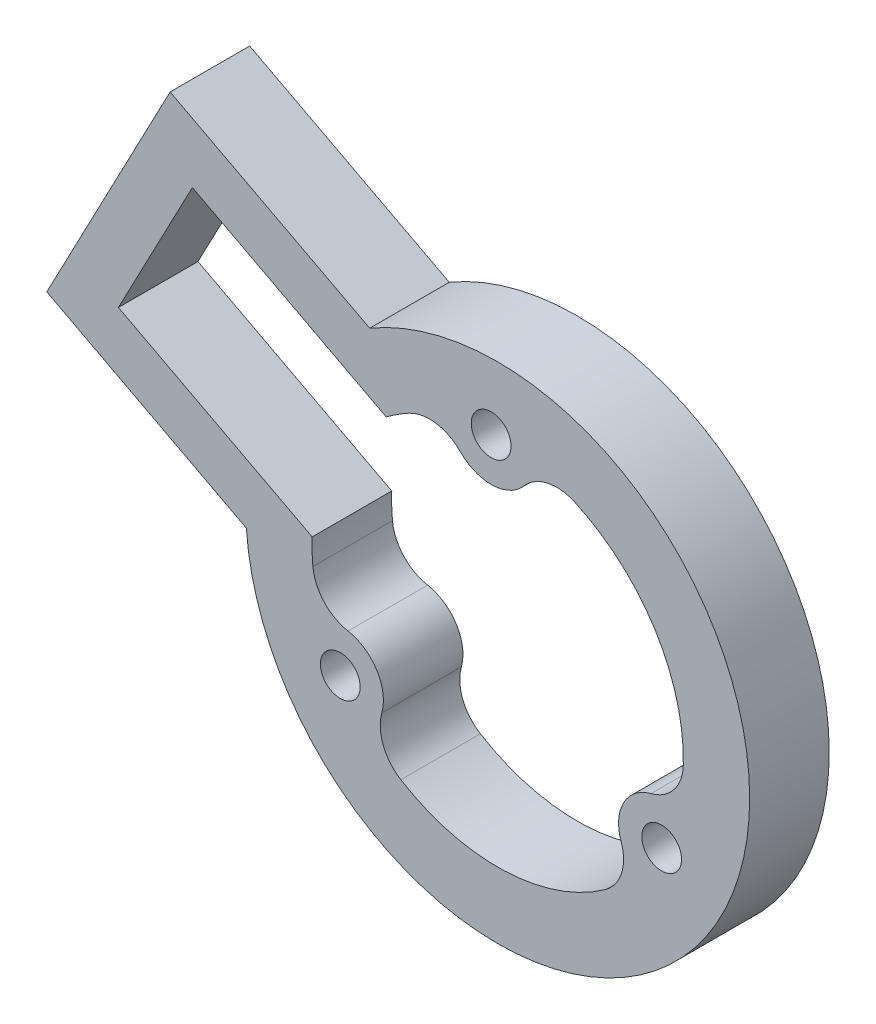
ISO-10303-21;
HEADER;
FILE_DESCRIPTION(('STEP AP214'),'2;1');
FILE_NAME('part.step','',(''),(''),'','','');
FILE_SCHEMA(('AUTOMOTIVE_DESIGN { 1 0 10303 214 1 1 1 1 }'));
ENDSEC;
DATA;
#1=APPLICATION_CONTEXT('core data for automotive mechanical design processes');
#2=APPLICATION_PROTOCOL_DEFINITION('international standard','automotive_design',2000,#1);
#3=PRODUCT_CONTEXT('',#1,'mechanical');
#4=PRODUCT('Part','Part','',(#3));
#5=PRODUCT_RELATED_PRODUCT_CATEGORY('part','',(#4));
#6=PRODUCT_DEFINITION_FORMATION('','',#4);
#7=PRODUCT_DEFINITION_CONTEXT('part definition',#1,'design');
#8=PRODUCT_DEFINITION('design','',#6,#7);
#9=PRODUCT_DEFINITION_SHAPE('','',#8);
#10=(LENGTH_UNIT() NAMED_UNIT(*) SI_UNIT(.MILLI.,.METRE.));
#11=(NAMED_UNIT(*) PLANE_ANGLE_UNIT() SI_UNIT($,.RADIAN.));
#12=(NAMED_UNIT(*) SI_UNIT($,.STERADIAN.) SOLID_ANGLE_UNIT());
#13=UNCERTAINTY_MEASURE_WITH_UNIT(LENGTH_MEASURE(1.E-05),#10,'distance_accuracy_value','');
#14=(GEOMETRIC_REPRESENTATION_CONTEXT(3) GLOBAL_UNCERTAINTY_ASSIGNED_CONTEXT((#13)) GLOBAL_UNIT_ASSIGNED_CONTEXT((#10,
#11,#12)) REPRESENTATION_CONTEXT('',''));
#15=CARTESIAN_POINT('',(0.,0.,0.));
#16=DIRECTION('',(0.,0.,1.));
#17=DIRECTION('',(1.,0.,0.));
#18=AXIS2_PLACEMENT_3D('',#15,#16,#17);
#19=CARTESIAN_POINT('',(0.,0.,6.));
#20=DIRECTION('',(0.,0.,1.));
#21=DIRECTION('',(1.,0.,0.));
#22=AXIS2_PLACEMENT_3D('',#19,#20,#21);
#23=PLANE('',#22);
#24=CARTESIAN_POINT('',(0.,0.,6.));
#25=DIRECTION('',(0.,0.,1.));
#26=DIRECTION('',(1.,0.,0.));
#27=AXIS2_PLACEMENT_3D('',#24,#25,#26);
#28=CIRCLE('',#27,14.);
#29=CARTESIAN_POINT('',(13.9955052642864,-0.354728624911595,6.));
#30=VERTEX_POINT('',#29);
#31=CARTESIAN_POINT('',(5.80690829075814,12.7389095335011,6.));
#32=VERTEX_POINT('',#31);
#33=EDGE_CURVE('E178',#30,#32,#28,.T.);
#34=ORIENTED_EDGE('',*,*,#33,.F.);
#35=CARTESIAN_POINT('',(10.7465486850771,-0.272380908414255,6.));
#36=DIRECTION('',(0.,0.,1.));
#37=DIRECTION('',(1.,0.,0.));
#38=AXIS2_PLACEMENT_3D('',#35,#36,#37);
#39=CIRCLE('',#38,3.25);
#40=CARTESIAN_POINT('',(11.5551312818012,-3.42018874630315,6.));
#41=VERTEX_POINT('',#40);
#42=EDGE_CURVE('E170',#41,#30,#39,.T.);
#43=ORIENTED_EDGE('',*,*,#42,.F.);
#44=CARTESIAN_POINT('',(12.3637138785254,-6.56799658419206,6.));
#45=DIRECTION('',(0.,0.,-1.));
#46=DIRECTION('',(1.,0.,0.));
#47=AXIS2_PLACEMENT_3D('',#44,#45,#46);
#48=CIRCLE('',#47,3.25);
#49=CARTESIAN_POINT('',(9.30272212200573,-7.66016390952212,6.));
#50=VERTEX_POINT('',#49);
#51=EDGE_CURVE('E221',#50,#41,#48,.T.);
#52=ORIENTED_EDGE('',*,*,#51,.F.);
#53=CARTESIAN_POINT('',(6.24173036548606,-8.75233123485219,6.));
#54=DIRECTION('',(0.,0.,1.));
#55=DIRECTION('',(1.,0.,0.));
#56=AXIS2_PLACEMENT_3D('',#53,#54,#55);
#57=CIRCLE('',#56,3.25);
#58=CARTESIAN_POINT('',(8.12876512714463,-11.3983848639936,6.));
#59=VERTEX_POINT('',#58);
#60=EDGE_CURVE('E219',#59,#50,#57,.T.);
#61=ORIENTED_EDGE('',*,*,#60,.F.);
#62=CARTESIAN_POINT('',(0.,0.,6.));
#63=DIRECTION('',(0.,0.,1.));
#64=DIRECTION('',(1.,0.,0.));
#65=AXIS2_PLACEMENT_3D('',#62,#63,#64);
#66=CIRCLE('',#65,14.);
#67=CARTESIAN_POINT('',(-7.30495663276615,-11.9430987852151,6.));
#68=VERTEX_POINT('',#67);
#69=EDGE_CURVE('E217',#68,#59,#66,.T.);
#70=ORIENTED_EDGE('',*,*,#69,.F.);
#71=CARTESIAN_POINT('',(-5.60916312873115,-9.17059371007586,6.));
#72=DIRECTION('',(0.,0.,1.));
#73=DIRECTION('',(1.,0.,0.));
#74=AXIS2_PLACEMENT_3D('',#71,#72,#73);
#75=CIRCLE('',#74,3.25);
#76=CARTESIAN_POINT('',(-8.73953598093679,-8.29694286095253,6.));
#77=VERTEX_POINT('',#76);
#78=EDGE_CURVE('E215',#77,#68,#75,.T.);
#79=ORIENTED_EDGE('',*,*,#78,.F.);
#80=CARTESIAN_POINT('',(-11.8699088331424,-7.4232920118292,6.));
#81=DIRECTION('',(0.,0.,-1.));
#82=DIRECTION('',(1.,0.,0.));
#83=AXIS2_PLACEMENT_3D('',#80,#81,#82);
#84=CIRCLE('',#83,3.25);
#85=CARTESIAN_POINT('',(-11.2852576038017,-4.22631172724338,6.));
#86=VERTEX_POINT('',#85);
#87=EDGE_CURVE('E213',#86,#77,#84,.T.);
#88=ORIENTED_EDGE('',*,*,#87,.F.);
#89=CARTESIAN_POINT('',(-10.7006063744611,-1.02933144265756,6.));
#90=DIRECTION('',(0.,0.,1.));
#91=DIRECTION('',(1.,0.,0.));
#92=AXIS2_PLACEMENT_3D('',#89,#90,#91);
#93=CIRCLE('',#92,3.25);
#94=CARTESIAN_POINT('',(-13.9356734179028,-1.34052466950752,6.));
#95=VERTEX_POINT('',#94);
#96=EDGE_CURVE('E211',#95,#86,#93,.T.);
#97=ORIENTED_EDGE('',*,*,#96,.F.);
#98=CARTESIAN_POINT('',(0.,0.,6.));
#99=DIRECTION('',(0.,0.,1.));
#100=DIRECTION('',(1.,0.,0.));
#101=AXIS2_PLACEMENT_3D('',#98,#99,#100);
#102=CIRCLE('',#101,14.);
#103=CARTESIAN_POINT('',(-13.9883844032285,0.570176979115798,6.));
#104=VERTEX_POINT('',#103);
#105=EDGE_CURVE('E209',#104,#95,#102,.T.);
#106=ORIENTED_EDGE('',*,*,#105,.F.);
#107=DIRECTION('',(0.885303878193953,-0.465012949555974,0.));
#108=VECTOR('',#107,1.);
#109=CARTESIAN_POINT('',(-28.6015499792665,8.24585918749596,6.));
#110=LINE('',#109,#108);
#111=CARTESIAN_POINT('',(-28.6015499792665,8.24585918749596,6.));
#112=VERTEX_POINT('',#111);
#113=EDGE_CURVE('E207',#112,#104,#110,.T.);
#114=ORIENTED_EDGE('',*,*,#113,.F.);
#115=DIRECTION('',(-0.465012949555981,-0.885303878193949,0.));
#116=VECTOR('',#115,1.);
#117=CARTESIAN_POINT('',(-23.0213945845947,18.8695057258234,6.));
#118=LINE('',#117,#116);
#119=CARTESIAN_POINT('',(-23.0213945845947,18.8695057258234,6.));
#120=VERTEX_POINT('',#119);
#121=EDGE_CURVE('E205',#120,#112,#118,.T.);
#122=ORIENTED_EDGE('',*,*,#121,.F.);
#123=DIRECTION('',(-0.885303878193952,0.465012949555975,0.));
#124=VECTOR('',#123,1.);
#125=CARTESIAN_POINT('',(-11.5124441680734,12.8243373815957,6.));
#126=LINE('',#125,#124);
#127=CARTESIAN_POINT('',(-8.40822900855676,11.1938235174432,6.));
#128=VERTEX_POINT('',#127);
#129=EDGE_CURVE('E203',#128,#120,#126,.T.);
#130=ORIENTED_EDGE('',*,*,#129,.F.);
#131=CARTESIAN_POINT('',(0.,0.,6.));
#132=DIRECTION('',(0.,0.,1.));
#133=DIRECTION('',(1.,0.,0.));
#134=AXIS2_PLACEMENT_3D('',#131,#132,#133);
#135=CIRCLE('',#134,14.);
#136=CARTESIAN_POINT('',(-6.69054863152024,12.2978274101267,6.));
#137=VERTEX_POINT('',#136);
#138=EDGE_CURVE('E201',#137,#128,#135,.T.);
#139=ORIENTED_EDGE('',*,*,#138,.F.);
#140=CARTESIAN_POINT('',(-5.1373855563459,9.44297461849011,6.));
#141=DIRECTION('',(0.,0.,1.));
#142=DIRECTION('',(1.,0.,0.));
#143=AXIS2_PLACEMENT_3D('',#140,#141,#142);
#144=CIRCLE('',#143,3.25);
#145=CARTESIAN_POINT('',(-2.81559530086442,11.7171316072557,6.));
#146=VERTEX_POINT('',#145);
#147=EDGE_CURVE('E199',#146,#137,#144,.T.);
#148=ORIENTED_EDGE('',*,*,#147,.F.);
#149=CARTESIAN_POINT('',(-0.493805045382954,13.9912885960213,6.));
#150=DIRECTION('',(0.,0.,-1.));
#151=DIRECTION('',(1.,0.,0.));
#152=AXIS2_PLACEMENT_3D('',#149,#150,#151);
#153=CIRCLE('',#152,3.25);
#154=CARTESIAN_POINT('',(1.98253548179602,11.8864756367655,6.));
#155=VERTEX_POINT('',#154);
#156=EDGE_CURVE('E194',#155,#146,#153,.T.);
#157=ORIENTED_EDGE('',*,*,#156,.F.);
#158=CARTESIAN_POINT('',(4.458876008975,9.78166267750975,6.));
#159=DIRECTION('',(0.,0.,1.));
#160=DIRECTION('',(1.,0.,0.));
#161=AXIS2_PLACEMENT_3D('',#158,#159,#160);
#162=CIRCLE('',#161,3.25);
#163=EDGE_CURVE('E192',#32,#155,#162,.T.);
#164=ORIENTED_EDGE('',*,*,#163,.F.);
#165=EDGE_LOOP('',(#34,#43,#52,#61,#70,#79,#88,#97,#106,#114,#122,#130,#139,#148,#157,#164));
#166=FACE_BOUND('',#165,.T.);
#167=CARTESIAN_POINT('',(12.3637138785254,-6.56799658419206,6.));
#168=DIRECTION('',(0.,0.,1.));
#169=DIRECTION('',(1.,0.,0.));
#170=AXIS2_PLACEMENT_3D('',#167,#168,#169);
#171=CIRCLE('',#170,1.50000000000007);
#172=CARTESIAN_POINT('',(13.8637138785255,-6.56799658419206,6.));
#173=VERTEX_POINT('',#172);
#174=EDGE_CURVE('E296',#173,#173,#171,.T.);
#175=ORIENTED_EDGE('',*,*,#174,.F.);
#176=EDGE_LOOP('',(#175));
#177=FACE_BOUND('',#176,.T.);
#178=CARTESIAN_POINT('',(0.,0.,6.));
#179=DIRECTION('',(0.,0.,1.));
#180=DIRECTION('',(1.,0.,0.));
#181=AXIS2_PLACEMENT_3D('',#178,#179,#180);
#182=CIRCLE('',#181,19.);
#183=CARTESIAN_POINT('',(-18.952651360969,-1.34052466950752,6.));
#184=VERTEX_POINT('',#183);
#185=CARTESIAN_POINT('',(-9.65239236984949,16.3655528943715,6.));
#186=VERTEX_POINT('',#185);
#187=EDGE_CURVE('E308',#184,#186,#182,.T.);
#188=ORIENTED_EDGE('',*,*,#187,.T.);
#189=DIRECTION('',(-0.88530387819395,0.46501294955598,0.));
#190=VECTOR('',#189,1.);
#191=CARTESIAN_POINT('',(-9.65239236984949,16.3655528943715,6.));
#192=LINE('',#191,#190);
#193=CARTESIAN_POINT('',(-24.7025582991466,24.2707730368232,6.));
#194=VERTEX_POINT('',#193);
#195=EDGE_CURVE('E311',#186,#194,#192,.T.);
#196=ORIENTED_EDGE('',*,*,#195,.T.);
#197=DIRECTION('',(-0.465012949555977,-0.885303878193951,0.));
#198=VECTOR('',#197,1.);
#199=CARTESIAN_POINT('',(-24.7025582991466,24.2707730368232,6.));
#200=LINE('',#199,#198);
#201=CARTESIAN_POINT('',(-34.0028172902662,6.56469547294415,6.));
#202=VERTEX_POINT('',#201);
#203=EDGE_CURVE('E314',#194,#202,#200,.T.);
#204=ORIENTED_EDGE('',*,*,#203,.T.);
#205=DIRECTION('',(0.885303878193949,-0.465012949555981,0.));
#206=VECTOR('',#205,1.);
#207=CARTESIAN_POINT('',(-18.952651360969,-1.34052466950752,6.));
#208=LINE('',#207,#206);
#209=EDGE_CURVE('E316',#202,#184,#208,.T.);
#210=ORIENTED_EDGE('',*,*,#209,.T.);
#211=EDGE_LOOP('',(#188,#196,#204,#210));
#212=FACE_BOUND('',#211,.T.);
#213=CARTESIAN_POINT('',(-0.493805045382954,13.9912885960213,6.));
#214=DIRECTION('',(0.,0.,1.));
#215=DIRECTION('',(1.,0.,0.));
#216=AXIS2_PLACEMENT_3D('',#213,#214,#215);
#217=CIRCLE('',#216,1.5);
#218=CARTESIAN_POINT('',(1.00619495461705,13.9912885960213,6.));
#219=VERTEX_POINT('',#218);
#220=EDGE_CURVE('E302',#219,#219,#217,.T.);
#221=ORIENTED_EDGE('',*,*,#220,.F.);
#222=EDGE_LOOP('',(#221));
#223=FACE_BOUND('',#222,.T.);
#224=CARTESIAN_POINT('',(-11.8699088331424,-7.4232920118292,6.));
#225=DIRECTION('',(0.,0.,1.));
#226=DIRECTION('',(1.,0.,0.));
#227=AXIS2_PLACEMENT_3D('',#224,#225,#226);
#228=CIRCLE('',#227,1.50000000000014);
#229=CARTESIAN_POINT('',(-10.3699088331423,-7.4232920118292,6.));
#230=VERTEX_POINT('',#229);
#231=EDGE_CURVE('E224',#230,#230,#228,.T.);
#232=ORIENTED_EDGE('',*,*,#231,.F.);
#233=EDGE_LOOP('',(#232));
#234=FACE_BOUND('',#233,.T.);
#235=ADVANCED_FACE('F33',(#166,#177,#212,#223,#234),#23,.T.);
#236=CARTESIAN_POINT('',(0.,0.,0.));
#237=DIRECTION('',(0.,0.,1.));
#238=DIRECTION('',(1.,0.,0.));
#239=AXIS2_PLACEMENT_3D('',#236,#237,#238);
#240=PLANE('',#239);
#241=CARTESIAN_POINT('',(12.3637138785254,-6.56799658419206,0.));
#242=DIRECTION('',(0.,0.,1.));
#243=DIRECTION('',(1.,0.,0.));
#244=AXIS2_PLACEMENT_3D('',#241,#242,#243);
#245=CIRCLE('',#244,1.50000000000007);
#246=CARTESIAN_POINT('',(13.8637138785255,-6.56799658419206,0.));
#247=VERTEX_POINT('',#246);
#248=EDGE_CURVE('E186',#247,#247,#245,.T.);
#249=ORIENTED_EDGE('',*,*,#248,.T.);
#250=EDGE_LOOP('',(#249));
#251=FACE_BOUND('',#250,.T.);
#252=CARTESIAN_POINT('',(-0.493805045382954,13.9912885960213,0.));
#253=DIRECTION('',(0.,0.,1.));
#254=DIRECTION('',(1.,0.,0.));
#255=AXIS2_PLACEMENT_3D('',#252,#253,#254);
#256=CIRCLE('',#255,1.5);
#257=CARTESIAN_POINT('',(1.00619495461705,13.9912885960213,0.));
#258=VERTEX_POINT('',#257);
#259=EDGE_CURVE('E299',#258,#258,#256,.T.);
#260=ORIENTED_EDGE('',*,*,#259,.T.);
#261=EDGE_LOOP('',(#260));
#262=FACE_BOUND('',#261,.T.);
#263=CARTESIAN_POINT('',(0.,0.,0.));
#264=DIRECTION('',(0.,0.,1.));
#265=DIRECTION('',(1.,0.,0.));
#266=AXIS2_PLACEMENT_3D('',#263,#264,#265);
#267=CIRCLE('',#266,19.);
#268=CARTESIAN_POINT('',(-18.952651360969,-1.34052466950752,0.));
#269=VERTEX_POINT('',#268);
#270=CARTESIAN_POINT('',(-9.65239236984949,16.3655528943715,0.));
#271=VERTEX_POINT('',#270);
#272=EDGE_CURVE('E305',#269,#271,#267,.T.);
#273=ORIENTED_EDGE('',*,*,#272,.F.);
#274=DIRECTION('',(0.885303878193949,-0.465012949555981,0.));
#275=VECTOR('',#274,1.);
#276=CARTESIAN_POINT('',(-18.952651360969,-1.34052466950752,0.));
#277=LINE('',#276,#275);
#278=CARTESIAN_POINT('',(-34.0028172902662,6.56469547294415,0.));
#279=VERTEX_POINT('',#278);
#280=EDGE_CURVE('E312',#279,#269,#277,.T.);
#281=ORIENTED_EDGE('',*,*,#280,.F.);
#282=DIRECTION('',(-0.465012949555977,-0.885303878193951,0.));
#283=VECTOR('',#282,1.);
#284=CARTESIAN_POINT('',(-24.7025582991466,24.2707730368232,0.));
#285=LINE('',#284,#283);
#286=CARTESIAN_POINT('',(-24.7025582991466,24.2707730368232,0.));
#287=VERTEX_POINT('',#286);
#288=EDGE_CURVE('E323',#287,#279,#285,.T.);
#289=ORIENTED_EDGE('',*,*,#288,.F.);
#290=DIRECTION('',(-0.88530387819395,0.46501294955598,0.));
#291=VECTOR('',#290,1.);
#292=CARTESIAN_POINT('',(-9.65239236984949,16.3655528943715,0.));
#293=LINE('',#292,#291);
#294=EDGE_CURVE('E321',#271,#287,#293,.T.);
#295=ORIENTED_EDGE('',*,*,#294,.F.);
#296=EDGE_LOOP('',(#273,#281,#289,#295));
#297=FACE_BOUND('',#296,.T.);
#298=CARTESIAN_POINT('',(10.7465486850771,-0.272380908414255,0.));
#299=DIRECTION('',(0.,0.,1.));
#300=DIRECTION('',(1.,0.,0.));
#301=AXIS2_PLACEMENT_3D('',#298,#299,#300);
#302=CIRCLE('',#301,3.25);
#303=CARTESIAN_POINT('',(11.5551312818012,-3.42018874630315,0.));
#304=VERTEX_POINT('',#303);
#305=CARTESIAN_POINT('',(13.9955052642864,-0.354728624911595,0.));
#306=VERTEX_POINT('',#305);
#307=EDGE_CURVE('E56',#304,#306,#302,.T.);
#308=ORIENTED_EDGE('',*,*,#307,.T.);
#309=CARTESIAN_POINT('',(0.,0.,0.));
#310=DIRECTION('',(0.,0.,1.));
#311=DIRECTION('',(1.,0.,0.));
#312=AXIS2_PLACEMENT_3D('',#309,#310,#311);
#313=CIRCLE('',#312,14.);
#314=CARTESIAN_POINT('',(5.80690829075814,12.7389095335011,0.));
#315=VERTEX_POINT('',#314);
#316=EDGE_CURVE('E185',#306,#315,#313,.T.);
#317=ORIENTED_EDGE('',*,*,#316,.T.);
#318=CARTESIAN_POINT('',(4.458876008975,9.78166267750975,0.));
#319=DIRECTION('',(0.,0.,1.));
#320=DIRECTION('',(1.,0.,0.));
#321=AXIS2_PLACEMENT_3D('',#318,#319,#320);
#322=CIRCLE('',#321,3.25);
#323=CARTESIAN_POINT('',(1.98253548179602,11.8864756367655,0.));
#324=VERTEX_POINT('',#323);
#325=EDGE_CURVE('E226',#315,#324,#322,.T.);
#326=ORIENTED_EDGE('',*,*,#325,.T.);
#327=CARTESIAN_POINT('',(-0.493805045382954,13.9912885960213,0.));
#328=DIRECTION('',(0.,0.,-1.));
#329=DIRECTION('',(1.,0.,0.));
#330=AXIS2_PLACEMENT_3D('',#327,#328,#329);
#331=CIRCLE('',#330,3.25);
#332=CARTESIAN_POINT('',(-2.81559530086442,11.7171316072557,0.));
#333=VERTEX_POINT('',#332);
#334=EDGE_CURVE('E229',#324,#333,#331,.T.);
#335=ORIENTED_EDGE('',*,*,#334,.T.);
#336=CARTESIAN_POINT('',(-5.1373855563459,9.44297461849011,0.));
#337=DIRECTION('',(0.,0.,1.));
#338=DIRECTION('',(1.,0.,0.));
#339=AXIS2_PLACEMENT_3D('',#336,#337,#338);
#340=CIRCLE('',#339,3.25);
#341=CARTESIAN_POINT('',(-6.69054863152024,12.2978274101267,0.));
#342=VERTEX_POINT('',#341);
#343=EDGE_CURVE('E232',#333,#342,#340,.T.);
#344=ORIENTED_EDGE('',*,*,#343,.T.);
#345=CARTESIAN_POINT('',(0.,0.,0.));
#346=DIRECTION('',(0.,0.,1.));
#347=DIRECTION('',(1.,0.,0.));
#348=AXIS2_PLACEMENT_3D('',#345,#346,#347);
#349=CIRCLE('',#348,14.);
#350=CARTESIAN_POINT('',(-8.40822900855676,11.1938235174432,0.));
#351=VERTEX_POINT('',#350);
#352=EDGE_CURVE('E235',#342,#351,#349,.T.);
#353=ORIENTED_EDGE('',*,*,#352,.T.);
#354=DIRECTION('',(-0.885303878193949,0.465012949555981,0.));
#355=VECTOR('',#354,1.);
#356=CARTESIAN_POINT('',(-11.5124441680734,12.8243373815957,0.));
#357=LINE('',#356,#355);
#358=CARTESIAN_POINT('',(-23.0213945845947,18.8695057258234,0.));
#359=VERTEX_POINT('',#358);
#360=EDGE_CURVE('E238',#351,#359,#357,.T.);
#361=ORIENTED_EDGE('',*,*,#360,.T.);
#362=DIRECTION('',(-0.465012949555981,-0.885303878193949,0.));
#363=VECTOR('',#362,1.);
#364=CARTESIAN_POINT('',(-23.0213945845947,18.8695057258234,0.));
#365=LINE('',#364,#363);
#366=CARTESIAN_POINT('',(-28.6015499792665,8.24585918749596,0.));
#367=VERTEX_POINT('',#366);
#368=EDGE_CURVE('E241',#359,#367,#365,.T.);
#369=ORIENTED_EDGE('',*,*,#368,.T.);
#370=DIRECTION('',(0.885303878193952,-0.465012949555974,0.));
#371=VECTOR('',#370,1.);
#372=CARTESIAN_POINT('',(-17.0925995627451,2.20069084326828,0.));
#373=LINE('',#372,#371);
#374=CARTESIAN_POINT('',(-13.9883844032285,0.570176979115798,0.));
#375=VERTEX_POINT('',#374);
#376=EDGE_CURVE('E244',#367,#375,#373,.T.);
#377=ORIENTED_EDGE('',*,*,#376,.T.);
#378=CARTESIAN_POINT('',(0.,0.,0.));
#379=DIRECTION('',(0.,0.,1.));
#380=DIRECTION('',(1.,0.,0.));
#381=AXIS2_PLACEMENT_3D('',#378,#379,#380);
#382=CIRCLE('',#381,14.);
#383=CARTESIAN_POINT('',(-13.9356734179028,-1.34052466950752,0.));
#384=VERTEX_POINT('',#383);
#385=EDGE_CURVE('E247',#375,#384,#382,.T.);
#386=ORIENTED_EDGE('',*,*,#385,.T.);
#387=CARTESIAN_POINT('',(-10.7006063744611,-1.02933144265756,0.));
#388=DIRECTION('',(0.,0.,1.));
#389=DIRECTION('',(1.,0.,0.));
#390=AXIS2_PLACEMENT_3D('',#387,#388,#389);
#391=CIRCLE('',#390,3.25);
#392=CARTESIAN_POINT('',(-11.2852576038017,-4.22631172724338,0.));
#393=VERTEX_POINT('',#392);
#394=EDGE_CURVE('E250',#384,#393,#391,.T.);
#395=ORIENTED_EDGE('',*,*,#394,.T.);
#396=CARTESIAN_POINT('',(-11.8699088331424,-7.4232920118292,0.));
#397=DIRECTION('',(0.,0.,-1.));
#398=DIRECTION('',(1.,0.,0.));
#399=AXIS2_PLACEMENT_3D('',#396,#397,#398);
#400=CIRCLE('',#399,3.25);
#401=CARTESIAN_POINT('',(-8.73953598093679,-8.29694286095253,0.));
#402=VERTEX_POINT('',#401);
#403=EDGE_CURVE('E253',#393,#402,#400,.T.);
#404=ORIENTED_EDGE('',*,*,#403,.T.);
#405=CARTESIAN_POINT('',(-5.60916312873115,-9.17059371007586,0.));
#406=DIRECTION('',(0.,0.,1.));
#407=DIRECTION('',(1.,0.,0.));
#408=AXIS2_PLACEMENT_3D('',#405,#406,#407);
#409=CIRCLE('',#408,3.25);
#410=CARTESIAN_POINT('',(-7.30495663276615,-11.9430987852151,0.));
#411=VERTEX_POINT('',#410);
#412=EDGE_CURVE('E256',#402,#411,#409,.T.);
#413=ORIENTED_EDGE('',*,*,#412,.T.);
#414=CARTESIAN_POINT('',(0.,0.,0.));
#415=DIRECTION('',(0.,0.,1.));
#416=DIRECTION('',(1.,0.,0.));
#417=AXIS2_PLACEMENT_3D('',#414,#415,#416);
#418=CIRCLE('',#417,14.);
#419=CARTESIAN_POINT('',(8.12876512714463,-11.3983848639936,0.));
#420=VERTEX_POINT('',#419);
#421=EDGE_CURVE('E259',#411,#420,#418,.T.);
#422=ORIENTED_EDGE('',*,*,#421,.T.);
#423=CARTESIAN_POINT('',(6.24173036548606,-8.75233123485219,0.));
#424=DIRECTION('',(0.,0.,1.));
#425=DIRECTION('',(1.,0.,0.));
#426=AXIS2_PLACEMENT_3D('',#423,#424,#425);
#427=CIRCLE('',#426,3.25);
#428=CARTESIAN_POINT('',(9.30272212200573,-7.66016390952212,0.));
#429=VERTEX_POINT('',#428);
#430=EDGE_CURVE('E262',#420,#429,#427,.T.);
#431=ORIENTED_EDGE('',*,*,#430,.T.);
#432=CARTESIAN_POINT('',(12.3637138785254,-6.56799658419206,0.));
#433=DIRECTION('',(0.,0.,-1.));
#434=DIRECTION('',(1.,0.,0.));
#435=AXIS2_PLACEMENT_3D('',#432,#433,#434);
#436=CIRCLE('',#435,3.25);
#437=EDGE_CURVE('E179',#429,#304,#436,.T.);
#438=ORIENTED_EDGE('',*,*,#437,.T.);
#439=EDGE_LOOP('',(#308,#317,#326,#335,#344,#353,#361,#369,#377,#386,#395,#404,#413,#422,#431,#438));
#440=FACE_BOUND('',#439,.T.);
#441=CARTESIAN_POINT('',(-11.8699088331424,-7.4232920118292,0.));
#442=DIRECTION('',(0.,0.,1.));
#443=DIRECTION('',(1.,0.,0.));
#444=AXIS2_PLACEMENT_3D('',#441,#442,#443);
#445=CIRCLE('',#444,1.50000000000014);
#446=CARTESIAN_POINT('',(-10.3699088331423,-7.4232920118292,0.));
#447=VERTEX_POINT('',#446);
#448=EDGE_CURVE('E388',#447,#447,#445,.T.);
#449=ORIENTED_EDGE('',*,*,#448,.T.);
#450=EDGE_LOOP('',(#449));
#451=FACE_BOUND('',#450,.T.);
#452=ADVANCED_FACE('F341',(#251,#262,#297,#440,#451),#240,.F.);
#453=CARTESIAN_POINT('',(0.,0.,6.));
#454=DIRECTION('',(0.,0.,-1.));
#455=DIRECTION('',(-1.,0.,0.));
#456=AXIS2_PLACEMENT_3D('',#453,#454,#455);
#457=CYLINDRICAL_SURFACE('',#456,19.);
#458=ORIENTED_EDGE('',*,*,#272,.T.);
#459=DIRECTION('',(0.,0.,-1.));
#460=VECTOR('',#459,1.);
#461=CARTESIAN_POINT('',(-9.65239236984949,16.3655528943715,6.));
#462=LINE('',#461,#460);
#463=EDGE_CURVE('E11',#186,#271,#462,.T.);
#464=ORIENTED_EDGE('',*,*,#463,.F.);
#465=ORIENTED_EDGE('',*,*,#187,.F.);
#466=DIRECTION('',(0.,0.,-1.));
#467=VECTOR('',#466,1.);
#468=CARTESIAN_POINT('',(-18.952651360969,-1.34052466950752,6.));
#469=LINE('',#468,#467);
#470=EDGE_CURVE('E318',#184,#269,#469,.T.);
#471=ORIENTED_EDGE('',*,*,#470,.T.);
#472=EDGE_LOOP('',(#458,#464,#465,#471));
#473=FACE_BOUND('',#472,.T.);
#474=ADVANCED_FACE('F35',(#473),#457,.T.);
#475=CARTESIAN_POINT('',(-9.65239236984949,16.3655528943715,6.));
#476=DIRECTION('',(-0.46501294955598,-0.885303878193949,0.));
#477=DIRECTION('',(0.88530387819395,-0.46501294955598,0.));
#478=AXIS2_PLACEMENT_3D('',#475,#476,#477);
#479=PLANE('',#478);
#480=ORIENTED_EDGE('',*,*,#294,.T.);
#481=DIRECTION('',(0.,0.,-1.));
#482=VECTOR('',#481,1.);
#483=CARTESIAN_POINT('',(-24.7025582991466,24.2707730368232,6.));
#484=LINE('',#483,#482);
#485=EDGE_CURVE('E41',#194,#287,#484,.T.);
#486=ORIENTED_EDGE('',*,*,#485,.F.);
#487=ORIENTED_EDGE('',*,*,#195,.F.);
#488=ORIENTED_EDGE('',*,*,#463,.T.);
#489=EDGE_LOOP('',(#480,#486,#487,#488));
#490=FACE_BOUND('',#489,.T.);
#491=ADVANCED_FACE('F352',(#490),#479,.F.);
#492=CARTESIAN_POINT('',(-24.7025582991466,24.2707730368232,6.));
#493=DIRECTION('',(0.885303878193951,-0.465012949555977,0.));
#494=DIRECTION('',(0.465012949555977,0.885303878193951,0.));
#495=AXIS2_PLACEMENT_3D('',#492,#493,#494);
#496=PLANE('',#495);
#497=ORIENTED_EDGE('',*,*,#288,.T.);
#498=DIRECTION('',(0.,0.,-1.));
#499=VECTOR('',#498,1.);
#500=CARTESIAN_POINT('',(-34.0028172902662,6.56469547294415,6.));
#501=LINE('',#500,#499);
#502=EDGE_CURVE('E328',#202,#279,#501,.T.);
#503=ORIENTED_EDGE('',*,*,#502,.F.);
#504=ORIENTED_EDGE('',*,*,#203,.F.);
#505=ORIENTED_EDGE('',*,*,#485,.T.);
#506=EDGE_LOOP('',(#497,#503,#504,#505));
#507=FACE_BOUND('',#506,.T.);
#508=ADVANCED_FACE('F335',(#507),#496,.F.);
#509=CARTESIAN_POINT('',(-18.952651360969,-1.34052466950752,6.));
#510=DIRECTION('',(0.465012949555981,0.885303878193949,0.));
#511=DIRECTION('',(-0.885303878193949,0.465012949555981,0.));
#512=AXIS2_PLACEMENT_3D('',#509,#510,#511);
#513=PLANE('',#512);
#514=ORIENTED_EDGE('',*,*,#280,.T.);
#515=ORIENTED_EDGE('',*,*,#470,.F.);
#516=ORIENTED_EDGE('',*,*,#209,.F.);
#517=ORIENTED_EDGE('',*,*,#502,.T.);
#518=EDGE_LOOP('',(#514,#515,#516,#517));
#519=FACE_BOUND('',#518,.T.);
#520=ADVANCED_FACE('F345',(#519),#513,.F.);
#521=CARTESIAN_POINT('',(-0.493805045382954,13.9912885960213,6.));
#522=DIRECTION('',(0.,0.,-1.));
#523=DIRECTION('',(-1.,0.,0.));
#524=AXIS2_PLACEMENT_3D('',#521,#522,#523);
#525=CYLINDRICAL_SURFACE('',#524,1.5);
#526=ORIENTED_EDGE('',*,*,#220,.T.);
#527=EDGE_LOOP('',(#526));
#528=FACE_BOUND('',#527,.T.);
#529=ORIENTED_EDGE('',*,*,#259,.F.);
#530=EDGE_LOOP('',(#529));
#531=FACE_BOUND('',#530,.T.);
#532=ADVANCED_FACE('F367',(#528,#531),#525,.F.);
#533=CARTESIAN_POINT('',(12.3637138785254,-6.56799658419206,6.));
#534=DIRECTION('',(0.,0.,-1.));
#535=DIRECTION('',(-1.,0.,0.));
#536=AXIS2_PLACEMENT_3D('',#533,#534,#535);
#537=CYLINDRICAL_SURFACE('',#536,1.50000000000007);
#538=ORIENTED_EDGE('',*,*,#174,.T.);
#539=EDGE_LOOP('',(#538));
#540=FACE_BOUND('',#539,.T.);
#541=ORIENTED_EDGE('',*,*,#248,.F.);
#542=EDGE_LOOP('',(#541));
#543=FACE_BOUND('',#542,.T.);
#544=ADVANCED_FACE('F374',(#540,#543),#537,.F.);
#545=CARTESIAN_POINT('',(10.7465486850771,-0.272380908414255,6.));
#546=DIRECTION('',(0.,0.,-1.));
#547=DIRECTION('',(-1.,0.,0.));
#548=AXIS2_PLACEMENT_3D('',#545,#546,#547);
#549=CYLINDRICAL_SURFACE('',#548,3.25);
#550=ORIENTED_EDGE('',*,*,#307,.F.);
#551=DIRECTION('',(0.,0.,-1.));
#552=VECTOR('',#551,1.);
#553=CARTESIAN_POINT('',(11.5551312818012,-3.42018874630315,6.));
#554=LINE('',#553,#552);
#555=EDGE_CURVE('E174',#41,#304,#554,.T.);
#556=ORIENTED_EDGE('',*,*,#555,.F.);
#557=ORIENTED_EDGE('',*,*,#42,.T.);
#558=DIRECTION('',(0.,0.,-1.));
#559=VECTOR('',#558,1.);
#560=CARTESIAN_POINT('',(13.9955052642864,-0.354728624911595,6.));
#561=LINE('',#560,#559);
#562=EDGE_CURVE('E173',#30,#306,#561,.T.);
#563=ORIENTED_EDGE('',*,*,#562,.T.);
#564=EDGE_LOOP('',(#550,#556,#557,#563));
#565=FACE_BOUND('',#564,.T.);
#566=ADVANCED_FACE('F172',(#565),#549,.F.);
#567=CARTESIAN_POINT('',(0.,0.,6.));
#568=DIRECTION('',(0.,0.,-1.));
#569=DIRECTION('',(-1.,0.,0.));
#570=AXIS2_PLACEMENT_3D('',#567,#568,#569);
#571=CYLINDRICAL_SURFACE('',#570,14.);
#572=ORIENTED_EDGE('',*,*,#316,.F.);
#573=ORIENTED_EDGE('',*,*,#562,.F.);
#574=ORIENTED_EDGE('',*,*,#33,.T.);
#575=DIRECTION('',(0.,0.,-1.));
#576=VECTOR('',#575,1.);
#577=CARTESIAN_POINT('',(5.80690829075814,12.7389095335011,6.));
#578=LINE('',#577,#576);
#579=EDGE_CURVE('E187',#32,#315,#578,.T.);
#580=ORIENTED_EDGE('',*,*,#579,.T.);
#581=EDGE_LOOP('',(#572,#573,#574,#580));
#582=FACE_BOUND('',#581,.T.);
#583=ADVANCED_FACE('F182',(#582),#571,.F.);
#584=CARTESIAN_POINT('',(4.458876008975,9.78166267750975,6.));
#585=DIRECTION('',(0.,0.,-1.));
#586=DIRECTION('',(-1.,0.,0.));
#587=AXIS2_PLACEMENT_3D('',#584,#585,#586);
#588=CYLINDRICAL_SURFACE('',#587,3.25);
#589=ORIENTED_EDGE('',*,*,#325,.F.);
#590=ORIENTED_EDGE('',*,*,#579,.F.);
#591=ORIENTED_EDGE('',*,*,#163,.T.);
#592=DIRECTION('',(0.,0.,-1.));
#593=VECTOR('',#592,1.);
#594=CARTESIAN_POINT('',(1.98253548179602,11.8864756367655,6.));
#595=LINE('',#594,#593);
#596=EDGE_CURVE('E293',#155,#324,#595,.T.);
#597=ORIENTED_EDGE('',*,*,#596,.T.);
#598=EDGE_LOOP('',(#589,#590,#591,#597));
#599=FACE_BOUND('',#598,.T.);
#600=ADVANCED_FACE('F450',(#599),#588,.F.);
#601=CARTESIAN_POINT('',(-0.493805045382954,13.9912885960213,6.));
#602=DIRECTION('',(0.,0.,-1.));
#603=DIRECTION('',(-1.,0.,0.));
#604=AXIS2_PLACEMENT_3D('',#601,#602,#603);
#605=CYLINDRICAL_SURFACE('',#604,3.25);
#606=ORIENTED_EDGE('',*,*,#334,.F.);
#607=ORIENTED_EDGE('',*,*,#596,.F.);
#608=ORIENTED_EDGE('',*,*,#156,.T.);
#609=DIRECTION('',(0.,0.,-1.));
#610=VECTOR('',#609,1.);
#611=CARTESIAN_POINT('',(-2.81559530086442,11.7171316072557,6.));
#612=LINE('',#611,#610);
#613=EDGE_CURVE('E291',#146,#333,#612,.T.);
#614=ORIENTED_EDGE('',*,*,#613,.T.);
#615=EDGE_LOOP('',(#606,#607,#608,#614));
#616=FACE_BOUND('',#615,.T.);
#617=ADVANCED_FACE('F446',(#616),#605,.T.);
#618=CARTESIAN_POINT('',(-5.1373855563459,9.44297461849011,6.));
#619=DIRECTION('',(0.,0.,-1.));
#620=DIRECTION('',(-1.,0.,0.));
#621=AXIS2_PLACEMENT_3D('',#618,#619,#620);
#622=CYLINDRICAL_SURFACE('',#621,3.25);
#623=ORIENTED_EDGE('',*,*,#343,.F.);
#624=ORIENTED_EDGE('',*,*,#613,.F.);
#625=ORIENTED_EDGE('',*,*,#147,.T.);
#626=DIRECTION('',(0.,0.,-1.));
#627=VECTOR('',#626,1.);
#628=CARTESIAN_POINT('',(-6.69054863152024,12.2978274101267,6.));
#629=LINE('',#628,#627);
#630=EDGE_CURVE('E289',#137,#342,#629,.T.);
#631=ORIENTED_EDGE('',*,*,#630,.T.);
#632=EDGE_LOOP('',(#623,#624,#625,#631));
#633=FACE_BOUND('',#632,.T.);
#634=ADVANCED_FACE('F442',(#633),#622,.F.);
#635=CARTESIAN_POINT('',(0.,0.,6.));
#636=DIRECTION('',(0.,0.,-1.));
#637=DIRECTION('',(-1.,0.,0.));
#638=AXIS2_PLACEMENT_3D('',#635,#636,#637);
#639=CYLINDRICAL_SURFACE('',#638,14.);
#640=ORIENTED_EDGE('',*,*,#352,.F.);
#641=ORIENTED_EDGE('',*,*,#630,.F.);
#642=ORIENTED_EDGE('',*,*,#138,.T.);
#643=DIRECTION('',(0.,0.,-1.));
#644=VECTOR('',#643,1.);
#645=CARTESIAN_POINT('',(-8.40822900855676,11.1938235174432,6.));
#646=LINE('',#645,#644);
#647=EDGE_CURVE('E286',#128,#351,#646,.T.);
#648=ORIENTED_EDGE('',*,*,#647,.T.);
#649=EDGE_LOOP('',(#640,#641,#642,#648));
#650=FACE_BOUND('',#649,.T.);
#651=ADVANCED_FACE('F438',(#650),#639,.F.);
#652=CARTESIAN_POINT('',(-11.5124441680734,12.8243373815957,6.));
#653=DIRECTION('',(-0.465012949555981,-0.885303878193949,0.));
#654=DIRECTION('',(0.885303878193949,-0.465012949555981,0.));
#655=AXIS2_PLACEMENT_3D('',#652,#653,#654);
#656=PLANE('',#655);
#657=ORIENTED_EDGE('',*,*,#360,.F.);
#658=ORIENTED_EDGE('',*,*,#647,.F.);
#659=ORIENTED_EDGE('',*,*,#129,.T.);
#660=DIRECTION('',(0.,0.,-1.));
#661=VECTOR('',#660,1.);
#662=CARTESIAN_POINT('',(-23.0213945845947,18.8695057258234,6.));
#663=LINE('',#662,#661);
#664=EDGE_CURVE('E284',#120,#359,#663,.T.);
#665=ORIENTED_EDGE('',*,*,#664,.T.);
#666=EDGE_LOOP('',(#657,#658,#659,#665));
#667=FACE_BOUND('',#666,.T.);
#668=ADVANCED_FACE('F434',(#667),#656,.T.);
#669=CARTESIAN_POINT('',(-23.0213945845947,18.8695057258234,6.));
#670=DIRECTION('',(0.885303878193949,-0.46501294955598,0.));
#671=DIRECTION('',(0.465012949555981,0.88530387819395,0.));
#672=AXIS2_PLACEMENT_3D('',#669,#670,#671);
#673=PLANE('',#672);
#674=ORIENTED_EDGE('',*,*,#368,.F.);
#675=ORIENTED_EDGE('',*,*,#664,.F.);
#676=ORIENTED_EDGE('',*,*,#121,.T.);
#677=DIRECTION('',(0.,0.,-1.));
#678=VECTOR('',#677,1.);
#679=CARTESIAN_POINT('',(-28.6015499792665,8.24585918749596,6.));
#680=LINE('',#679,#678);
#681=EDGE_CURVE('E281',#112,#367,#680,.T.);
#682=ORIENTED_EDGE('',*,*,#681,.T.);
#683=EDGE_LOOP('',(#674,#675,#676,#682));
#684=FACE_BOUND('',#683,.T.);
#685=ADVANCED_FACE('F430',(#684),#673,.T.);
#686=CARTESIAN_POINT('',(-17.0925995627451,2.20069084326828,6.));
#687=DIRECTION('',(0.465012949555975,0.885303878193953,0.));
#688=DIRECTION('',(-0.885303878193953,0.465012949555975,0.));
#689=AXIS2_PLACEMENT_3D('',#686,#687,#688);
#690=PLANE('',#689);
#691=ORIENTED_EDGE('',*,*,#376,.F.);
#692=ORIENTED_EDGE('',*,*,#681,.F.);
#693=ORIENTED_EDGE('',*,*,#113,.T.);
#694=DIRECTION('',(0.,0.,-1.));
#695=VECTOR('',#694,1.);
#696=CARTESIAN_POINT('',(-13.9883844032285,0.570176979115798,6.));
#697=LINE('',#696,#695);
#698=EDGE_CURVE('E279',#104,#375,#697,.T.);
#699=ORIENTED_EDGE('',*,*,#698,.T.);
#700=EDGE_LOOP('',(#691,#692,#693,#699));
#701=FACE_BOUND('',#700,.T.);
#702=ADVANCED_FACE('F426',(#701),#690,.T.);
#703=CARTESIAN_POINT('',(0.,0.,6.));
#704=DIRECTION('',(0.,0.,-1.));
#705=DIRECTION('',(-1.,0.,0.));
#706=AXIS2_PLACEMENT_3D('',#703,#704,#705);
#707=CYLINDRICAL_SURFACE('',#706,14.);
#708=ORIENTED_EDGE('',*,*,#385,.F.);
#709=ORIENTED_EDGE('',*,*,#698,.F.);
#710=ORIENTED_EDGE('',*,*,#105,.T.);
#711=DIRECTION('',(0.,0.,-1.));
#712=VECTOR('',#711,1.);
#713=CARTESIAN_POINT('',(-13.9356734179028,-1.34052466950752,6.));
#714=LINE('',#713,#712);
#715=EDGE_CURVE('E277',#95,#384,#714,.T.);
#716=ORIENTED_EDGE('',*,*,#715,.T.);
#717=EDGE_LOOP('',(#708,#709,#710,#716));
#718=FACE_BOUND('',#717,.T.);
#719=ADVANCED_FACE('F422',(#718),#707,.F.);
#720=CARTESIAN_POINT('',(-10.7006063744611,-1.02933144265756,6.));
#721=DIRECTION('',(0.,0.,-1.));
#722=DIRECTION('',(-1.,0.,0.));
#723=AXIS2_PLACEMENT_3D('',#720,#721,#722);
#724=CYLINDRICAL_SURFACE('',#723,3.25);
#725=ORIENTED_EDGE('',*,*,#394,.F.);
#726=ORIENTED_EDGE('',*,*,#715,.F.);
#727=ORIENTED_EDGE('',*,*,#96,.T.);
#728=DIRECTION('',(0.,0.,-1.));
#729=VECTOR('',#728,1.);
#730=CARTESIAN_POINT('',(-11.2852576038017,-4.22631172724338,6.));
#731=LINE('',#730,#729);
#732=EDGE_CURVE('E275',#86,#393,#731,.T.);
#733=ORIENTED_EDGE('',*,*,#732,.T.);
#734=EDGE_LOOP('',(#725,#726,#727,#733));
#735=FACE_BOUND('',#734,.T.);
#736=ADVANCED_FACE('F418',(#735),#724,.F.);
#737=CARTESIAN_POINT('',(-11.8699088331424,-7.4232920118292,6.));
#738=DIRECTION('',(0.,0.,-1.));
#739=DIRECTION('',(-1.,0.,0.));
#740=AXIS2_PLACEMENT_3D('',#737,#738,#739);
#741=CYLINDRICAL_SURFACE('',#740,3.25);
#742=ORIENTED_EDGE('',*,*,#403,.F.);
#743=ORIENTED_EDGE('',*,*,#732,.F.);
#744=ORIENTED_EDGE('',*,*,#87,.T.);
#745=DIRECTION('',(0.,0.,-1.));
#746=VECTOR('',#745,1.);
#747=CARTESIAN_POINT('',(-8.73953598093679,-8.29694286095253,6.));
#748=LINE('',#747,#746);
#749=EDGE_CURVE('E273',#77,#402,#748,.T.);
#750=ORIENTED_EDGE('',*,*,#749,.T.);
#751=EDGE_LOOP('',(#742,#743,#744,#750));
#752=FACE_BOUND('',#751,.T.);
#753=ADVANCED_FACE('F414',(#752),#741,.T.);
#754=CARTESIAN_POINT('',(-5.60916312873115,-9.17059371007586,6.));
#755=DIRECTION('',(0.,0.,-1.));
#756=DIRECTION('',(-1.,0.,0.));
#757=AXIS2_PLACEMENT_3D('',#754,#755,#756);
#758=CYLINDRICAL_SURFACE('',#757,3.25);
#759=ORIENTED_EDGE('',*,*,#412,.F.);
#760=ORIENTED_EDGE('',*,*,#749,.F.);
#761=ORIENTED_EDGE('',*,*,#78,.T.);
#762=DIRECTION('',(0.,0.,-1.));
#763=VECTOR('',#762,1.);
#764=CARTESIAN_POINT('',(-7.30495663276615,-11.9430987852151,6.));
#765=LINE('',#764,#763);
#766=EDGE_CURVE('E271',#68,#411,#765,.T.);
#767=ORIENTED_EDGE('',*,*,#766,.T.);
#768=EDGE_LOOP('',(#759,#760,#761,#767));
#769=FACE_BOUND('',#768,.T.);
#770=ADVANCED_FACE('F410',(#769),#758,.F.);
#771=CARTESIAN_POINT('',(0.,0.,6.));
#772=DIRECTION('',(0.,0.,-1.));
#773=DIRECTION('',(-1.,0.,0.));
#774=AXIS2_PLACEMENT_3D('',#771,#772,#773);
#775=CYLINDRICAL_SURFACE('',#774,14.);
#776=ORIENTED_EDGE('',*,*,#421,.F.);
#777=ORIENTED_EDGE('',*,*,#766,.F.);
#778=ORIENTED_EDGE('',*,*,#69,.T.);
#779=DIRECTION('',(0.,0.,-1.));
#780=VECTOR('',#779,1.);
#781=CARTESIAN_POINT('',(8.12876512714463,-11.3983848639936,6.));
#782=LINE('',#781,#780);
#783=EDGE_CURVE('E269',#59,#420,#782,.T.);
#784=ORIENTED_EDGE('',*,*,#783,.T.);
#785=EDGE_LOOP('',(#776,#777,#778,#784));
#786=FACE_BOUND('',#785,.T.);
#787=ADVANCED_FACE('F406',(#786),#775,.F.);
#788=CARTESIAN_POINT('',(6.24173036548606,-8.75233123485219,6.));
#789=DIRECTION('',(0.,0.,-1.));
#790=DIRECTION('',(-1.,0.,0.));
#791=AXIS2_PLACEMENT_3D('',#788,#789,#790);
#792=CYLINDRICAL_SURFACE('',#791,3.25);
#793=ORIENTED_EDGE('',*,*,#430,.F.);
#794=ORIENTED_EDGE('',*,*,#783,.F.);
#795=ORIENTED_EDGE('',*,*,#60,.T.);
#796=DIRECTION('',(0.,0.,-1.));
#797=VECTOR('',#796,1.);
#798=CARTESIAN_POINT('',(9.30272212200573,-7.66016390952212,6.));
#799=LINE('',#798,#797);
#800=EDGE_CURVE('E48',#50,#429,#799,.T.);
#801=ORIENTED_EDGE('',*,*,#800,.T.);
#802=EDGE_LOOP('',(#793,#794,#795,#801));
#803=FACE_BOUND('',#802,.T.);
#804=ADVANCED_FACE('F401',(#803),#792,.F.);
#805=CARTESIAN_POINT('',(12.3637138785254,-6.56799658419206,6.));
#806=DIRECTION('',(0.,0.,-1.));
#807=DIRECTION('',(-1.,0.,0.));
#808=AXIS2_PLACEMENT_3D('',#805,#806,#807);
#809=CYLINDRICAL_SURFACE('',#808,3.25);
#810=ORIENTED_EDGE('',*,*,#437,.F.);
#811=ORIENTED_EDGE('',*,*,#800,.F.);
#812=ORIENTED_EDGE('',*,*,#51,.T.);
#813=ORIENTED_EDGE('',*,*,#555,.T.);
#814=EDGE_LOOP('',(#810,#811,#812,#813));
#815=FACE_BOUND('',#814,.T.);
#816=ADVANCED_FACE('F396',(#815),#809,.T.);
#817=CARTESIAN_POINT('',(-11.8699088331424,-7.4232920118292,6.));
#818=DIRECTION('',(0.,0.,-1.));
#819=DIRECTION('',(-1.,0.,0.));
#820=AXIS2_PLACEMENT_3D('',#817,#818,#819);
#821=CYLINDRICAL_SURFACE('',#820,1.50000000000014);
#822=ORIENTED_EDGE('',*,*,#231,.T.);
#823=EDGE_LOOP('',(#822));
#824=FACE_BOUND('',#823,.T.);
#825=ORIENTED_EDGE('',*,*,#448,.F.);
#826=EDGE_LOOP('',(#825));
#827=FACE_BOUND('',#826,.T.);
#828=ADVANCED_FACE('F394',(#824,#827),#821,.F.);
#829=CLOSED_SHELL('',(#235,#452,#474,#491,#508,#520,#532,#544,#566,#583,#600,#617,#634,#651,
#668,#685,#702,#719,#736,#753,#770,#787,#804,#816,#828));
#830=MANIFOLD_SOLID_BREP('B2',#829);
#831=ADVANCED_BREP_SHAPE_REPRESENTATION('',(#18,#830),#14);
#832=SHAPE_DEFINITION_REPRESENTATION(#9,#831);
ENDSEC;
END-ISO-10303-21;
